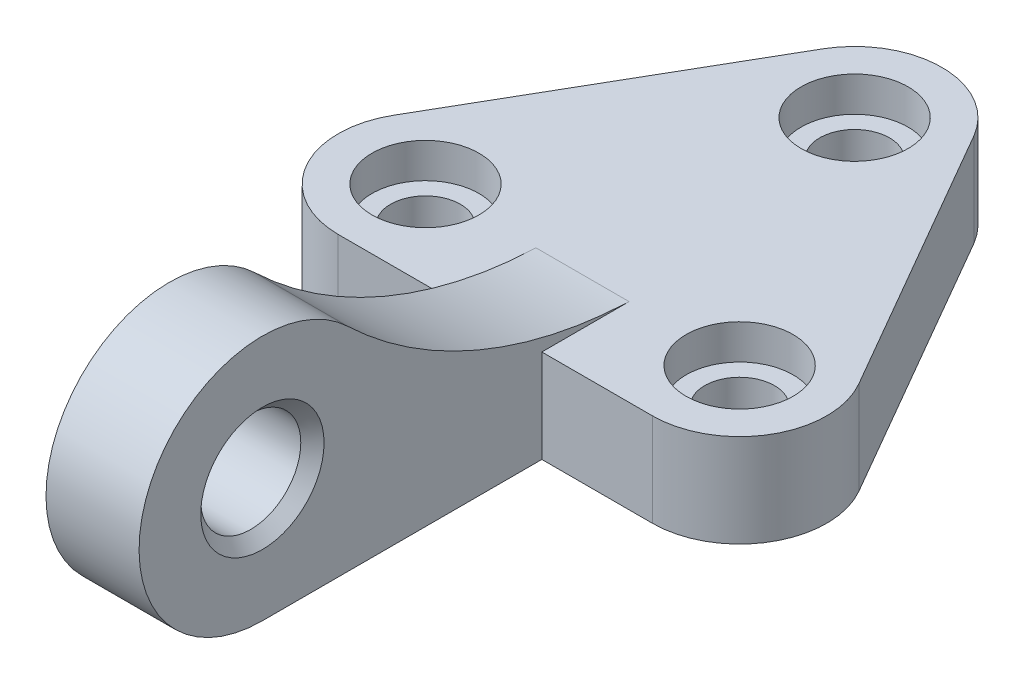
ISO-10303-21;
HEADER;
FILE_DESCRIPTION(('STEP AP214'),'2;1');
FILE_NAME('part.step','',(''),(''),'','','');
FILE_SCHEMA(('AUTOMOTIVE_DESIGN { 1 0 10303 214 1 1 1 1 }'));
ENDSEC;
DATA;
#1=APPLICATION_CONTEXT('core data for automotive mechanical design processes');
#2=APPLICATION_PROTOCOL_DEFINITION('international standard','automotive_design',2000,#1);
#3=PRODUCT_CONTEXT('',#1,'mechanical');
#4=PRODUCT('Part','Part','',(#3));
#5=PRODUCT_RELATED_PRODUCT_CATEGORY('part','',(#4));
#6=PRODUCT_DEFINITION_FORMATION('','',#4);
#7=PRODUCT_DEFINITION_CONTEXT('part definition',#1,'design');
#8=PRODUCT_DEFINITION('design','',#6,#7);
#9=PRODUCT_DEFINITION_SHAPE('','',#8);
#10=(LENGTH_UNIT() NAMED_UNIT(*) SI_UNIT(.MILLI.,.METRE.));
#11=(NAMED_UNIT(*) PLANE_ANGLE_UNIT() SI_UNIT($,.RADIAN.));
#12=(NAMED_UNIT(*) SI_UNIT($,.STERADIAN.) SOLID_ANGLE_UNIT());
#13=UNCERTAINTY_MEASURE_WITH_UNIT(LENGTH_MEASURE(1.E-05),#10,'distance_accuracy_value','');
#14=(GEOMETRIC_REPRESENTATION_CONTEXT(3) GLOBAL_UNCERTAINTY_ASSIGNED_CONTEXT((#13)) GLOBAL_UNIT_ASSIGNED_CONTEXT((#10,
#11,#12)) REPRESENTATION_CONTEXT('',''));
#15=CARTESIAN_POINT('',(0.,0.,0.));
#16=DIRECTION('',(0.,0.,1.));
#17=DIRECTION('',(1.,0.,0.));
#18=AXIS2_PLACEMENT_3D('',#15,#16,#17);
#19=CARTESIAN_POINT('',(64.9519052838322,40.,0.));
#20=DIRECTION('',(0.,0.,-1.));
#21=DIRECTION('',(-1.,0.,0.));
#22=AXIS2_PLACEMENT_3D('',#19,#20,#21);
#23=PLANE('',#22);
#24=DIRECTION('',(0.,-1.,0.));
#25=VECTOR('',#24,1.);
#26=CARTESIAN_POINT('',(112.451905283832,40.,0.));
#27=LINE('',#26,#25);
#28=CARTESIAN_POINT('',(112.451905283832,40.,1.94289029309402E-13));
#29=VERTEX_POINT('',#28);
#30=CARTESIAN_POINT('',(112.451905283832,0.,1.94289029309402E-13));
#31=VERTEX_POINT('',#30);
#32=EDGE_CURVE('E196',#29,#31,#27,.T.);
#33=ORIENTED_EDGE('',*,*,#32,.F.);
#34=DIRECTION('',(1.,0.,0.));
#35=VECTOR('',#34,1.);
#36=CARTESIAN_POINT('',(64.9519052838322,40.,0.));
#37=LINE('',#36,#35);
#38=CARTESIAN_POINT('',(64.9519052838322,40.,0.));
#39=VERTEX_POINT('',#38);
#40=EDGE_CURVE('E122',#39,#29,#37,.T.);
#41=ORIENTED_EDGE('',*,*,#40,.F.);
#42=DIRECTION('',(0.,-1.,0.));
#43=VECTOR('',#42,1.);
#44=CARTESIAN_POINT('',(64.9519052838322,40.,0.));
#45=LINE('',#44,#43);
#46=CARTESIAN_POINT('',(64.9519052838322,0.,0.));
#47=VERTEX_POINT('',#46);
#48=EDGE_CURVE('E133',#39,#47,#45,.T.);
#49=ORIENTED_EDGE('',*,*,#48,.T.);
#50=DIRECTION('',(1.,0.,0.));
#51=VECTOR('',#50,1.);
#52=CARTESIAN_POINT('',(64.9519052838322,0.,0.));
#53=LINE('',#52,#51);
#54=EDGE_CURVE('E159',#47,#31,#53,.T.);
#55=ORIENTED_EDGE('',*,*,#54,.T.);
#56=EDGE_LOOP('',(#33,#41,#49,#55));
#57=FACE_BOUND('',#56,.T.);
#58=ADVANCED_FACE('F39',(#57),#23,.F.);
#59=CARTESIAN_POINT('',(132.45190528383,40.,-154.413429510898));
#60=DIRECTION('',(0.,-1.,0.));
#61=DIRECTION('',(0.,0.,-1.));
#62=AXIS2_PLACEMENT_3D('',#59,#60,#61);
#63=CYLINDRICAL_SURFACE('',#62,37.5000000000003);
#64=CARTESIAN_POINT('',(132.45190528383,0.,-154.413429510898));
#65=DIRECTION('',(0.,1.,0.));
#66=DIRECTION('',(0.,0.,1.));
#67=AXIS2_PLACEMENT_3D('',#64,#65,#66);
#68=CIRCLE('',#67,37.5000000000003);
#69=CARTESIAN_POINT('',(164.927857925747,0.,-173.163429510899));
#70=VERTEX_POINT('',#69);
#71=CARTESIAN_POINT('',(99.9759526419135,0.,-173.163429510898));
#72=VERTEX_POINT('',#71);
#73=EDGE_CURVE('E146',#70,#72,#68,.T.);
#74=ORIENTED_EDGE('',*,*,#73,.T.);
#75=DIRECTION('',(0.,-1.,0.));
#76=VECTOR('',#75,1.);
#77=CARTESIAN_POINT('',(99.9759526419135,40.,-173.163429510898));
#78=LINE('',#77,#76);
#79=CARTESIAN_POINT('',(99.9759526419135,40.,-173.163429510898));
#80=VERTEX_POINT('',#79);
#81=EDGE_CURVE('E11',#80,#72,#78,.T.);
#82=ORIENTED_EDGE('',*,*,#81,.F.);
#83=CARTESIAN_POINT('',(132.45190528383,40.,-154.413429510898));
#84=DIRECTION('',(0.,1.,0.));
#85=DIRECTION('',(0.,0.,1.));
#86=AXIS2_PLACEMENT_3D('',#83,#84,#85);
#87=CIRCLE('',#86,37.5000000000003);
#88=CARTESIAN_POINT('',(164.927857925747,40.,-173.163429510899));
#89=VERTEX_POINT('',#88);
#90=EDGE_CURVE('E168',#89,#80,#87,.T.);
#91=ORIENTED_EDGE('',*,*,#90,.F.);
#92=DIRECTION('',(0.,-1.,0.));
#93=VECTOR('',#92,1.);
#94=CARTESIAN_POINT('',(164.927857925747,40.,-173.163429510899));
#95=LINE('',#94,#93);
#96=EDGE_CURVE('E141',#89,#70,#95,.T.);
#97=ORIENTED_EDGE('',*,*,#96,.T.);
#98=EDGE_LOOP('',(#74,#82,#91,#97));
#99=FACE_BOUND('',#98,.T.);
#100=ADVANCED_FACE('F41',(#99),#63,.T.);
#101=CARTESIAN_POINT('',(99.9759526419135,40.,-173.163429510898));
#102=DIRECTION('',(0.866025403784444,0.,0.499999999999992));
#103=DIRECTION('',(0.499999999999992,0.,-0.866025403784444));
#104=AXIS2_PLACEMENT_3D('',#101,#102,#103);
#105=PLANE('',#104);
#106=DIRECTION('',(-0.499999999999992,0.,0.866025403784444));
#107=VECTOR('',#106,1.);
#108=CARTESIAN_POINT('',(99.9759526419135,0.,-173.163429510898));
#109=LINE('',#108,#107);
#110=CARTESIAN_POINT('',(32.4759526419156,0.,-56.2499999999997));
#111=VERTEX_POINT('',#110);
#112=EDGE_CURVE('E150',#72,#111,#109,.T.);
#113=ORIENTED_EDGE('',*,*,#112,.T.);
#114=DIRECTION('',(0.,-1.,0.));
#115=VECTOR('',#114,1.);
#116=CARTESIAN_POINT('',(32.4759526419156,40.,-56.2499999999997));
#117=LINE('',#116,#115);
#118=CARTESIAN_POINT('',(32.4759526419156,40.,-56.2499999999997));
#119=VERTEX_POINT('',#118);
#120=EDGE_CURVE('E48',#119,#111,#117,.T.);
#121=ORIENTED_EDGE('',*,*,#120,.F.);
#122=DIRECTION('',(-0.499999999999992,0.,0.866025403784444));
#123=VECTOR('',#122,1.);
#124=CARTESIAN_POINT('',(99.9759526419135,40.,-173.163429510898));
#125=LINE('',#124,#123);
#126=EDGE_CURVE('E99',#80,#119,#125,.T.);
#127=ORIENTED_EDGE('',*,*,#126,.F.);
#128=ORIENTED_EDGE('',*,*,#81,.T.);
#129=EDGE_LOOP('',(#113,#121,#127,#128));
#130=FACE_BOUND('',#129,.T.);
#131=ADVANCED_FACE('F180',(#130),#105,.F.);
#132=CARTESIAN_POINT('',(64.9519052838321,40.,-37.5));
#133=DIRECTION('',(0.,-1.,0.));
#134=DIRECTION('',(0.,0.,-1.));
#135=AXIS2_PLACEMENT_3D('',#132,#133,#134);
#136=CYLINDRICAL_SURFACE('',#135,37.5);
#137=CARTESIAN_POINT('',(64.9519052838321,0.,-37.5));
#138=DIRECTION('',(0.,-1.,0.));
#139=DIRECTION('',(0.,0.,-1.));
#140=AXIS2_PLACEMENT_3D('',#137,#138,#139);
#141=CIRCLE('',#140,37.5);
#142=EDGE_CURVE('E155',#47,#111,#141,.T.);
#143=ORIENTED_EDGE('',*,*,#142,.F.);
#144=ORIENTED_EDGE('',*,*,#48,.F.);
#145=CARTESIAN_POINT('',(64.9519052838321,40.,-37.5));
#146=DIRECTION('',(0.,-1.,0.));
#147=DIRECTION('',(0.,0.,-1.));
#148=AXIS2_PLACEMENT_3D('',#145,#146,#147);
#149=CIRCLE('',#148,37.5);
#150=EDGE_CURVE('E123',#39,#119,#149,.T.);
#151=ORIENTED_EDGE('',*,*,#150,.T.);
#152=ORIENTED_EDGE('',*,*,#120,.T.);
#153=EDGE_LOOP('',(#143,#144,#151,#152));
#154=FACE_BOUND('',#153,.T.);
#155=ADVANCED_FACE('F178',(#154),#136,.T.);
#156=CARTESIAN_POINT('',(152.451905283832,40.,1.94289029309402E-13));
#157=VERTEX_POINT('',#156);
#158=CARTESIAN_POINT('',(199.951905283831,40.,0.));
#159=VERTEX_POINT('',#158);
#160=EDGE_CURVE('E109',#157,#159,#37,.T.);
#161=ORIENTED_EDGE('',*,*,#160,.F.);
#162=DIRECTION('',(0.,-1.,0.));
#163=VECTOR('',#162,1.);
#164=CARTESIAN_POINT('',(152.451905283832,40.,0.));
#165=LINE('',#164,#163);
#166=CARTESIAN_POINT('',(152.451905283832,0.,2.22044604925031E-13));
#167=VERTEX_POINT('',#166);
#168=EDGE_CURVE('E213',#157,#167,#165,.T.);
#169=ORIENTED_EDGE('',*,*,#168,.T.);
#170=CARTESIAN_POINT('',(199.951905283831,0.,0.));
#171=VERTEX_POINT('',#170);
#172=EDGE_CURVE('E129',#167,#171,#53,.T.);
#173=ORIENTED_EDGE('',*,*,#172,.T.);
#174=DIRECTION('',(0.,-1.,0.));
#175=VECTOR('',#174,1.);
#176=CARTESIAN_POINT('',(199.951905283831,40.,0.));
#177=LINE('',#176,#175);
#178=EDGE_CURVE('E126',#159,#171,#177,.T.);
#179=ORIENTED_EDGE('',*,*,#178,.F.);
#180=EDGE_LOOP('',(#161,#169,#173,#179));
#181=FACE_BOUND('',#180,.T.);
#182=ADVANCED_FACE('F127',(#181),#23,.F.);
#183=CARTESIAN_POINT('',(199.951905283831,40.,-37.4999999999996));
#184=DIRECTION('',(0.,-1.,0.));
#185=DIRECTION('',(0.,0.,-1.));
#186=AXIS2_PLACEMENT_3D('',#183,#184,#185);
#187=CYLINDRICAL_SURFACE('',#186,37.4999999999998);
#188=CARTESIAN_POINT('',(199.951905283831,0.,-37.4999999999996));
#189=DIRECTION('',(0.,1.,0.));
#190=DIRECTION('',(0.,0.,1.));
#191=AXIS2_PLACEMENT_3D('',#188,#189,#190);
#192=CIRCLE('',#191,37.4999999999998);
#193=CARTESIAN_POINT('',(232.427857925747,0.,-56.2499999999997));
#194=VERTEX_POINT('',#193);
#195=EDGE_CURVE('E163',#171,#194,#192,.T.);
#196=ORIENTED_EDGE('',*,*,#195,.T.);
#197=DIRECTION('',(0.,-1.,0.));
#198=VECTOR('',#197,1.);
#199=CARTESIAN_POINT('',(232.427857925747,40.,-56.2499999999997));
#200=LINE('',#199,#198);
#201=CARTESIAN_POINT('',(232.427857925747,40.,-56.2499999999997));
#202=VERTEX_POINT('',#201);
#203=EDGE_CURVE('E134',#202,#194,#200,.T.);
#204=ORIENTED_EDGE('',*,*,#203,.F.);
#205=CARTESIAN_POINT('',(199.951905283831,40.,-37.4999999999996));
#206=DIRECTION('',(0.,1.,0.));
#207=DIRECTION('',(0.,0.,1.));
#208=AXIS2_PLACEMENT_3D('',#205,#206,#207);
#209=CIRCLE('',#208,37.4999999999998);
#210=EDGE_CURVE('E114',#159,#202,#209,.T.);
#211=ORIENTED_EDGE('',*,*,#210,.F.);
#212=ORIENTED_EDGE('',*,*,#178,.T.);
#213=EDGE_LOOP('',(#196,#204,#211,#212));
#214=FACE_BOUND('',#213,.T.);
#215=ADVANCED_FACE('F136',(#214),#187,.T.);
#216=CARTESIAN_POINT('',(232.427857925748,40.,-56.2499999999998));
#217=DIRECTION('',(-0.866025403784436,0.,0.500000000000004));
#218=DIRECTION('',(0.500000000000004,0.,0.866025403784436));
#219=AXIS2_PLACEMENT_3D('',#216,#217,#218);
#220=PLANE('',#219);
#221=DIRECTION('',(-0.500000000000004,0.,-0.866025403784436));
#222=VECTOR('',#221,1.);
#223=CARTESIAN_POINT('',(232.427857925748,0.,-56.2499999999998));
#224=LINE('',#223,#222);
#225=EDGE_CURVE('E91',#194,#70,#224,.T.);
#226=ORIENTED_EDGE('',*,*,#225,.T.);
#227=ORIENTED_EDGE('',*,*,#96,.F.);
#228=DIRECTION('',(-0.500000000000004,0.,-0.866025403784436));
#229=VECTOR('',#228,1.);
#230=CARTESIAN_POINT('',(232.427857925748,40.,-56.2499999999998));
#231=LINE('',#230,#229);
#232=EDGE_CURVE('E64',#202,#89,#231,.T.);
#233=ORIENTED_EDGE('',*,*,#232,.F.);
#234=ORIENTED_EDGE('',*,*,#203,.T.);
#235=EDGE_LOOP('',(#226,#227,#233,#234));
#236=FACE_BOUND('',#235,.T.);
#237=ADVANCED_FACE('F252',(#236),#220,.F.);
#238=CARTESIAN_POINT('',(132.45190528383,40.,-154.413429510898));
#239=DIRECTION('',(0.,1.,0.));
#240=DIRECTION('',(0.,0.,1.));
#241=AXIS2_PLACEMENT_3D('',#238,#239,#240);
#242=PLANE('',#241);
#243=DIRECTION('',(0.,0.,-1.));
#244=VECTOR('',#243,1.);
#245=CARTESIAN_POINT('',(152.451905283832,40.,-154.413429510898));
#246=LINE('',#245,#244);
#247=CARTESIAN_POINT('',(152.451905283832,40.,-37.5));
#248=VERTEX_POINT('',#247);
#249=EDGE_CURVE('E118',#157,#248,#246,.T.);
#250=ORIENTED_EDGE('',*,*,#249,.F.);
#251=ORIENTED_EDGE('',*,*,#160,.T.);
#252=ORIENTED_EDGE('',*,*,#210,.T.);
#253=ORIENTED_EDGE('',*,*,#232,.T.);
#254=ORIENTED_EDGE('',*,*,#90,.T.);
#255=ORIENTED_EDGE('',*,*,#126,.T.);
#256=ORIENTED_EDGE('',*,*,#150,.F.);
#257=ORIENTED_EDGE('',*,*,#40,.T.);
#258=DIRECTION('',(0.,0.,-1.));
#259=VECTOR('',#258,1.);
#260=CARTESIAN_POINT('',(112.451905283832,40.,-154.413429510898));
#261=LINE('',#260,#259);
#262=CARTESIAN_POINT('',(112.451905283832,40.,-37.5));
#263=VERTEX_POINT('',#262);
#264=EDGE_CURVE('E469',#29,#263,#261,.T.);
#265=ORIENTED_EDGE('',*,*,#264,.T.);
#266=DIRECTION('',(-1.,0.,0.));
#267=VECTOR('',#266,1.);
#268=CARTESIAN_POINT('',(152.451905283832,40.,-37.5));
#269=LINE('',#268,#267);
#270=EDGE_CURVE('E464',#248,#263,#269,.T.);
#271=ORIENTED_EDGE('',*,*,#270,.F.);
#272=EDGE_LOOP('',(#250,#251,#252,#253,#254,#255,#256,#257,#265,#271));
#273=FACE_BOUND('',#272,.T.);
#274=CARTESIAN_POINT('',(64.9519052838321,40.,-37.5));
#275=DIRECTION('',(0.,1.,0.));
#276=DIRECTION('',(0.,0.,1.));
#277=AXIS2_PLACEMENT_3D('',#274,#275,#276);
#278=CIRCLE('',#277,23.);
#279=CARTESIAN_POINT('',(64.9519052838321,40.,-14.5));
#280=VERTEX_POINT('',#279);
#281=EDGE_CURVE('E230',#280,#280,#278,.T.);
#282=ORIENTED_EDGE('',*,*,#281,.F.);
#283=EDGE_LOOP('',(#282));
#284=FACE_BOUND('',#283,.T.);
#285=CARTESIAN_POINT('',(199.951905283831,40.,-37.4999999999996));
#286=DIRECTION('',(0.,1.,0.));
#287=DIRECTION('',(0.,0.,1.));
#288=AXIS2_PLACEMENT_3D('',#285,#286,#287);
#289=CIRCLE('',#288,23.);
#290=CARTESIAN_POINT('',(199.951905283831,40.,-14.4999999999997));
#291=VERTEX_POINT('',#290);
#292=EDGE_CURVE('E238',#291,#291,#289,.T.);
#293=ORIENTED_EDGE('',*,*,#292,.F.);
#294=EDGE_LOOP('',(#293));
#295=FACE_BOUND('',#294,.T.);
#296=CARTESIAN_POINT('',(132.45190528383,40.,-154.413429510898));
#297=DIRECTION('',(0.,1.,0.));
#298=DIRECTION('',(0.,0.,1.));
#299=AXIS2_PLACEMENT_3D('',#296,#297,#298);
#300=CIRCLE('',#299,23.);
#301=CARTESIAN_POINT('',(132.45190528383,40.,-131.413429510898));
#302=VERTEX_POINT('',#301);
#303=EDGE_CURVE('E217',#302,#302,#300,.T.);
#304=ORIENTED_EDGE('',*,*,#303,.F.);
#305=EDGE_LOOP('',(#304));
#306=FACE_BOUND('',#305,.T.);
#307=ADVANCED_FACE('F111',(#273,#284,#295,#306),#242,.T.);
#308=CARTESIAN_POINT('',(132.45190528383,0.,-154.413429510898));
#309=DIRECTION('',(0.,1.,0.));
#310=DIRECTION('',(0.,0.,1.));
#311=AXIS2_PLACEMENT_3D('',#308,#309,#310);
#312=PLANE('',#311);
#313=CARTESIAN_POINT('',(64.9519052838321,0.,-37.5));
#314=DIRECTION('',(0.,1.,0.));
#315=DIRECTION('',(0.,0.,1.));
#316=AXIS2_PLACEMENT_3D('',#313,#314,#315);
#317=CIRCLE('',#316,15.);
#318=CARTESIAN_POINT('',(64.9519052838321,0.,-22.5));
#319=VERTEX_POINT('',#318);
#320=EDGE_CURVE('E501',#319,#319,#317,.T.);
#321=ORIENTED_EDGE('',*,*,#320,.T.);
#322=EDGE_LOOP('',(#321));
#323=FACE_BOUND('',#322,.T.);
#324=CARTESIAN_POINT('',(199.951905283831,0.,-37.4999999999996));
#325=DIRECTION('',(0.,1.,0.));
#326=DIRECTION('',(0.,0.,1.));
#327=AXIS2_PLACEMENT_3D('',#324,#325,#326);
#328=CIRCLE('',#327,15.);
#329=CARTESIAN_POINT('',(199.951905283831,0.,-22.4999999999997));
#330=VERTEX_POINT('',#329);
#331=EDGE_CURVE('E497',#330,#330,#328,.T.);
#332=ORIENTED_EDGE('',*,*,#331,.T.);
#333=EDGE_LOOP('',(#332));
#334=FACE_BOUND('',#333,.T.);
#335=CARTESIAN_POINT('',(132.45190528383,0.,-154.413429510898));
#336=DIRECTION('',(0.,1.,0.));
#337=DIRECTION('',(0.,0.,1.));
#338=AXIS2_PLACEMENT_3D('',#335,#336,#337);
#339=CIRCLE('',#338,15.);
#340=CARTESIAN_POINT('',(132.45190528383,0.,-139.413429510898));
#341=VERTEX_POINT('',#340);
#342=EDGE_CURVE('E485',#341,#341,#339,.T.);
#343=ORIENTED_EDGE('',*,*,#342,.T.);
#344=EDGE_LOOP('',(#343));
#345=FACE_BOUND('',#344,.T.);
#346=ORIENTED_EDGE('',*,*,#172,.F.);
#347=DIRECTION('',(0.,0.,-1.));
#348=VECTOR('',#347,1.);
#349=CARTESIAN_POINT('',(152.451905283832,0.,120.086570489101));
#350=LINE('',#349,#348);
#351=CARTESIAN_POINT('',(152.451905283832,0.,120.086570489101));
#352=VERTEX_POINT('',#351);
#353=EDGE_CURVE('E212',#352,#167,#350,.T.);
#354=ORIENTED_EDGE('',*,*,#353,.F.);
#355=DIRECTION('',(-1.,0.,0.));
#356=VECTOR('',#355,1.);
#357=CARTESIAN_POINT('',(152.451905283832,0.,120.086570489101));
#358=LINE('',#357,#356);
#359=CARTESIAN_POINT('',(112.451905283832,0.,120.086570489101));
#360=VERTEX_POINT('',#359);
#361=EDGE_CURVE('E443',#352,#360,#358,.T.);
#362=ORIENTED_EDGE('',*,*,#361,.T.);
#363=DIRECTION('',(0.,0.,-1.));
#364=VECTOR('',#363,1.);
#365=CARTESIAN_POINT('',(112.451905283832,0.,0.));
#366=LINE('',#365,#364);
#367=EDGE_CURVE('E190',#360,#31,#366,.T.);
#368=ORIENTED_EDGE('',*,*,#367,.T.);
#369=ORIENTED_EDGE('',*,*,#54,.F.);
#370=ORIENTED_EDGE('',*,*,#142,.T.);
#371=ORIENTED_EDGE('',*,*,#112,.F.);
#372=ORIENTED_EDGE('',*,*,#73,.F.);
#373=ORIENTED_EDGE('',*,*,#225,.F.);
#374=ORIENTED_EDGE('',*,*,#195,.F.);
#375=EDGE_LOOP('',(#346,#354,#362,#368,#369,#370,#371,#372,#373,#374));
#376=FACE_BOUND('',#375,.T.);
#377=ADVANCED_FACE('F185',(#323,#334,#345,#376),#312,.F.);
#378=CARTESIAN_POINT('',(132.45190528383,25.,-154.413429510898));
#379=DIRECTION('',(0.,1.,0.));
#380=DIRECTION('',(0.,0.,1.));
#381=AXIS2_PLACEMENT_3D('',#378,#379,#380);
#382=CYLINDRICAL_SURFACE('',#381,23.);
#383=CARTESIAN_POINT('',(132.45190528383,25.,-154.413429510898));
#384=DIRECTION('',(0.,1.,0.));
#385=DIRECTION('',(0.,0.,1.));
#386=AXIS2_PLACEMENT_3D('',#383,#384,#385);
#387=CIRCLE('',#386,23.);
#388=CARTESIAN_POINT('',(132.45190528383,25.,-131.413429510898));
#389=VERTEX_POINT('',#388);
#390=EDGE_CURVE('E222',#389,#389,#387,.T.);
#391=ORIENTED_EDGE('',*,*,#390,.F.);
#392=EDGE_LOOP('',(#391));
#393=FACE_BOUND('',#392,.T.);
#394=ORIENTED_EDGE('',*,*,#303,.T.);
#395=EDGE_LOOP('',(#394));
#396=FACE_BOUND('',#395,.T.);
#397=ADVANCED_FACE('F317',(#393,#396),#382,.F.);
#398=CARTESIAN_POINT('',(132.45190528383,25.,-154.413429510898));
#399=DIRECTION('',(0.,1.,0.));
#400=DIRECTION('',(0.,0.,1.));
#401=AXIS2_PLACEMENT_3D('',#398,#399,#400);
#402=PLANE('',#401);
#403=CARTESIAN_POINT('',(132.45190528383,25.,-154.413429510898));
#404=DIRECTION('',(0.,1.,0.));
#405=DIRECTION('',(0.,0.,1.));
#406=AXIS2_PLACEMENT_3D('',#403,#404,#405);
#407=CIRCLE('',#406,15.);
#408=CARTESIAN_POINT('',(132.45190528383,25.,-139.413429510898));
#409=VERTEX_POINT('',#408);
#410=EDGE_CURVE('E489',#409,#409,#407,.T.);
#411=ORIENTED_EDGE('',*,*,#410,.F.);
#412=EDGE_LOOP('',(#411));
#413=FACE_BOUND('',#412,.T.);
#414=ORIENTED_EDGE('',*,*,#390,.T.);
#415=EDGE_LOOP('',(#414));
#416=FACE_BOUND('',#415,.T.);
#417=ADVANCED_FACE('F327',(#413,#416),#402,.T.);
#418=CARTESIAN_POINT('',(199.951905283831,25.,-37.4999999999996));
#419=DIRECTION('',(0.,1.,0.));
#420=DIRECTION('',(0.,0.,1.));
#421=AXIS2_PLACEMENT_3D('',#418,#419,#420);
#422=CYLINDRICAL_SURFACE('',#421,23.);
#423=CARTESIAN_POINT('',(199.951905283831,25.,-37.4999999999996));
#424=DIRECTION('',(0.,1.,0.));
#425=DIRECTION('',(0.,0.,1.));
#426=AXIS2_PLACEMENT_3D('',#423,#424,#425);
#427=CIRCLE('',#426,23.);
#428=CARTESIAN_POINT('',(199.951905283831,25.,-14.4999999999997));
#429=VERTEX_POINT('',#428);
#430=EDGE_CURVE('E234',#429,#429,#427,.T.);
#431=ORIENTED_EDGE('',*,*,#430,.F.);
#432=EDGE_LOOP('',(#431));
#433=FACE_BOUND('',#432,.T.);
#434=ORIENTED_EDGE('',*,*,#292,.T.);
#435=EDGE_LOOP('',(#434));
#436=FACE_BOUND('',#435,.T.);
#437=ADVANCED_FACE('F337',(#433,#436),#422,.F.);
#438=CARTESIAN_POINT('',(199.951905283831,25.,-37.4999999999996));
#439=DIRECTION('',(0.,1.,0.));
#440=DIRECTION('',(0.,0.,1.));
#441=AXIS2_PLACEMENT_3D('',#438,#439,#440);
#442=PLANE('',#441);
#443=CARTESIAN_POINT('',(199.951905283831,25.,-37.4999999999996));
#444=DIRECTION('',(0.,1.,0.));
#445=DIRECTION('',(0.,0.,1.));
#446=AXIS2_PLACEMENT_3D('',#443,#444,#445);
#447=CIRCLE('',#446,15.);
#448=CARTESIAN_POINT('',(199.951905283831,25.,-22.4999999999997));
#449=VERTEX_POINT('',#448);
#450=EDGE_CURVE('E493',#449,#449,#447,.T.);
#451=ORIENTED_EDGE('',*,*,#450,.F.);
#452=EDGE_LOOP('',(#451));
#453=FACE_BOUND('',#452,.T.);
#454=ORIENTED_EDGE('',*,*,#430,.T.);
#455=EDGE_LOOP('',(#454));
#456=FACE_BOUND('',#455,.T.);
#457=ADVANCED_FACE('F347',(#453,#456),#442,.T.);
#458=CARTESIAN_POINT('',(64.9519052838321,25.,-37.5));
#459=DIRECTION('',(0.,1.,0.));
#460=DIRECTION('',(0.,0.,1.));
#461=AXIS2_PLACEMENT_3D('',#458,#459,#460);
#462=CYLINDRICAL_SURFACE('',#461,23.);
#463=CARTESIAN_POINT('',(64.9519052838321,25.,-37.5));
#464=DIRECTION('',(0.,1.,0.));
#465=DIRECTION('',(0.,0.,1.));
#466=AXIS2_PLACEMENT_3D('',#463,#464,#465);
#467=CIRCLE('',#466,23.);
#468=CARTESIAN_POINT('',(64.9519052838321,25.,-14.5));
#469=VERTEX_POINT('',#468);
#470=EDGE_CURVE('E151',#469,#469,#467,.T.);
#471=ORIENTED_EDGE('',*,*,#470,.F.);
#472=EDGE_LOOP('',(#471));
#473=FACE_BOUND('',#472,.T.);
#474=ORIENTED_EDGE('',*,*,#281,.T.);
#475=EDGE_LOOP('',(#474));
#476=FACE_BOUND('',#475,.T.);
#477=ADVANCED_FACE('F356',(#473,#476),#462,.F.);
#478=CARTESIAN_POINT('',(64.9519052838321,25.,-37.5));
#479=DIRECTION('',(0.,1.,0.));
#480=DIRECTION('',(0.,0.,1.));
#481=AXIS2_PLACEMENT_3D('',#478,#479,#480);
#482=PLANE('',#481);
#483=CARTESIAN_POINT('',(64.9519052838321,25.,-37.5));
#484=DIRECTION('',(0.,1.,0.));
#485=DIRECTION('',(0.,0.,1.));
#486=AXIS2_PLACEMENT_3D('',#483,#484,#485);
#487=CIRCLE('',#486,15.);
#488=CARTESIAN_POINT('',(64.9519052838321,25.,-22.5));
#489=VERTEX_POINT('',#488);
#490=EDGE_CURVE('E505',#489,#489,#487,.T.);
#491=ORIENTED_EDGE('',*,*,#490,.F.);
#492=EDGE_LOOP('',(#491));
#493=FACE_BOUND('',#492,.T.);
#494=ORIENTED_EDGE('',*,*,#470,.T.);
#495=EDGE_LOOP('',(#494));
#496=FACE_BOUND('',#495,.T.);
#497=ADVANCED_FACE('F365',(#493,#496),#482,.T.);
#498=CARTESIAN_POINT('',(152.451905283832,53.,120.086570489101));
#499=DIRECTION('',(1.,0.,0.));
#500=DIRECTION('',(0.,0.,-1.));
#501=AXIS2_PLACEMENT_3D('',#498,#499,#500);
#502=PLANE('',#501);
#503=CARTESIAN_POINT('',(152.451905283832,53.,120.086570489101));
#504=DIRECTION('',(1.,0.,0.));
#505=DIRECTION('',(0.,0.,-1.));
#506=AXIS2_PLACEMENT_3D('',#503,#504,#505);
#507=CIRCLE('',#506,26.5);
#508=CARTESIAN_POINT('',(152.451905283832,53.,93.5865704891015));
#509=VERTEX_POINT('',#508);
#510=EDGE_CURVE('E481',#509,#509,#507,.T.);
#511=ORIENTED_EDGE('',*,*,#510,.F.);
#512=EDGE_LOOP('',(#511));
#513=FACE_BOUND('',#512,.T.);
#514=ORIENTED_EDGE('',*,*,#168,.F.);
#515=ORIENTED_EDGE('',*,*,#249,.T.);
#516=CARTESIAN_POINT('',(152.451905283832,224.865500344199,-44.5531399028419));
#517=DIRECTION('',(-1.,0.,0.));
#518=DIRECTION('',(0.,0.,1.));
#519=AXIS2_PLACEMENT_3D('',#516,#517,#518);
#520=CIRCLE('',#519,185.);
#521=CARTESIAN_POINT('',(152.451905283832,91.2366625942735,83.3856490612724));
#522=VERTEX_POINT('',#521);
#523=EDGE_CURVE('E456',#248,#522,#520,.T.);
#524=ORIENTED_EDGE('',*,*,#523,.T.);
#525=CARTESIAN_POINT('',(152.451905283832,53.,120.086570489101));
#526=DIRECTION('',(1.,0.,0.));
#527=DIRECTION('',(0.,0.,-1.));
#528=AXIS2_PLACEMENT_3D('',#525,#526,#527);
#529=CIRCLE('',#528,53.);
#530=EDGE_CURVE('E461',#522,#352,#529,.T.);
#531=ORIENTED_EDGE('',*,*,#530,.T.);
#532=ORIENTED_EDGE('',*,*,#353,.T.);
#533=EDGE_LOOP('',(#514,#515,#524,#531,#532));
#534=FACE_BOUND('',#533,.T.);
#535=ADVANCED_FACE('F214',(#513,#534),#502,.T.);
#536=CARTESIAN_POINT('',(112.451905283832,53.,120.086570489101));
#537=DIRECTION('',(1.,0.,0.));
#538=DIRECTION('',(0.,0.,-1.));
#539=AXIS2_PLACEMENT_3D('',#536,#537,#538);
#540=PLANE('',#539);
#541=CARTESIAN_POINT('',(112.451905283832,53.,120.086570489101));
#542=DIRECTION('',(1.,0.,0.));
#543=DIRECTION('',(0.,0.,-1.));
#544=AXIS2_PLACEMENT_3D('',#541,#542,#543);
#545=CIRCLE('',#544,21.5);
#546=CARTESIAN_POINT('',(112.451905283832,53.,98.5865704891015));
#547=VERTEX_POINT('',#546);
#548=EDGE_CURVE('E447',#547,#547,#545,.T.);
#549=ORIENTED_EDGE('',*,*,#548,.T.);
#550=EDGE_LOOP('',(#549));
#551=FACE_BOUND('',#550,.T.);
#552=ORIENTED_EDGE('',*,*,#264,.F.);
#553=ORIENTED_EDGE('',*,*,#32,.T.);
#554=ORIENTED_EDGE('',*,*,#367,.F.);
#555=CARTESIAN_POINT('',(112.451905283832,53.,120.086570489101));
#556=DIRECTION('',(1.,0.,0.));
#557=DIRECTION('',(0.,0.,-1.));
#558=AXIS2_PLACEMENT_3D('',#555,#556,#557);
#559=CIRCLE('',#558,53.);
#560=CARTESIAN_POINT('',(112.451905283832,91.2366625942735,83.3856490612724));
#561=VERTEX_POINT('',#560);
#562=EDGE_CURVE('E440',#561,#360,#559,.T.);
#563=ORIENTED_EDGE('',*,*,#562,.F.);
#564=CARTESIAN_POINT('',(112.451905283832,224.865500344199,-44.5531399028419));
#565=DIRECTION('',(-1.,0.,0.));
#566=DIRECTION('',(0.,0.,1.));
#567=AXIS2_PLACEMENT_3D('',#564,#565,#566);
#568=CIRCLE('',#567,185.);
#569=EDGE_CURVE('E55',#263,#561,#568,.T.);
#570=ORIENTED_EDGE('',*,*,#569,.F.);
#571=EDGE_LOOP('',(#552,#553,#554,#563,#570));
#572=FACE_BOUND('',#571,.T.);
#573=ADVANCED_FACE('F424',(#551,#572),#540,.F.);
#574=CARTESIAN_POINT('',(152.451905283832,53.,120.086570489101));
#575=DIRECTION('',(-1.,0.,0.));
#576=DIRECTION('',(0.,0.,1.));
#577=AXIS2_PLACEMENT_3D('',#574,#575,#576);
#578=CYLINDRICAL_SURFACE('',#577,53.);
#579=ORIENTED_EDGE('',*,*,#562,.T.);
#580=ORIENTED_EDGE('',*,*,#361,.F.);
#581=ORIENTED_EDGE('',*,*,#530,.F.);
#582=DIRECTION('',(-1.,0.,0.));
#583=VECTOR('',#582,1.);
#584=CARTESIAN_POINT('',(152.451905283832,91.2366625942735,83.3856490612724));
#585=LINE('',#584,#583);
#586=EDGE_CURVE('E445',#522,#561,#585,.T.);
#587=ORIENTED_EDGE('',*,*,#586,.T.);
#588=EDGE_LOOP('',(#579,#580,#581,#587));
#589=FACE_BOUND('',#588,.T.);
#590=ADVANCED_FACE('F428',(#589),#578,.T.);
#591=CARTESIAN_POINT('',(152.451905283832,224.865500344199,-44.5531399028419));
#592=DIRECTION('',(-1.,0.,0.));
#593=DIRECTION('',(0.,0.,1.));
#594=AXIS2_PLACEMENT_3D('',#591,#592,#593);
#595=CYLINDRICAL_SURFACE('',#594,185.);
#596=ORIENTED_EDGE('',*,*,#569,.T.);
#597=ORIENTED_EDGE('',*,*,#586,.F.);
#598=ORIENTED_EDGE('',*,*,#523,.F.);
#599=ORIENTED_EDGE('',*,*,#270,.T.);
#600=EDGE_LOOP('',(#596,#597,#598,#599));
#601=FACE_BOUND('',#600,.T.);
#602=ADVANCED_FACE('F421',(#601),#595,.F.);
#603=CARTESIAN_POINT('',(152.451905283832,53.,120.086570489101));
#604=DIRECTION('',(1.,0.,0.));
#605=DIRECTION('',(0.,0.,-1.));
#606=AXIS2_PLACEMENT_3D('',#603,#604,#605);
#607=CYLINDRICAL_SURFACE('',#606,21.5);
#608=ORIENTED_EDGE('',*,*,#548,.F.);
#609=EDGE_LOOP('',(#608));
#610=FACE_BOUND('',#609,.T.);
#611=CARTESIAN_POINT('',(147.451905283832,53.,120.086570489101));
#612=DIRECTION('',(1.,0.,0.));
#613=DIRECTION('',(0.,0.,-1.));
#614=AXIS2_PLACEMENT_3D('',#611,#612,#613);
#615=CIRCLE('',#614,21.5);
#616=CARTESIAN_POINT('',(147.451905283832,53.,98.5865704891015));
#617=VERTEX_POINT('',#616);
#618=EDGE_CURVE('E453',#617,#617,#615,.T.);
#619=ORIENTED_EDGE('',*,*,#618,.T.);
#620=EDGE_LOOP('',(#619));
#621=FACE_BOUND('',#620,.T.);
#622=ADVANCED_FACE('F417',(#610,#621),#607,.F.);
#623=CARTESIAN_POINT('',(152.451905283832,53.,120.086570489101));
#624=DIRECTION('',(1.,0.,0.));
#625=DIRECTION('',(0.,0.,-1.));
#626=AXIS2_PLACEMENT_3D('',#623,#624,#625);
#627=CONICAL_SURFACE('',#626,26.5,0.785398163397448);
#628=ORIENTED_EDGE('',*,*,#618,.F.);
#629=EDGE_LOOP('',(#628));
#630=FACE_BOUND('',#629,.T.);
#631=ORIENTED_EDGE('',*,*,#510,.T.);
#632=EDGE_LOOP('',(#631));
#633=FACE_BOUND('',#632,.T.);
#634=ADVANCED_FACE('F387',(#630,#633),#627,.F.);
#635=CARTESIAN_POINT('',(132.45190528383,25.,-154.413429510898));
#636=DIRECTION('',(0.,1.,0.));
#637=DIRECTION('',(0.,0.,1.));
#638=AXIS2_PLACEMENT_3D('',#635,#636,#637);
#639=CYLINDRICAL_SURFACE('',#638,15.);
#640=ORIENTED_EDGE('',*,*,#342,.F.);
#641=EDGE_LOOP('',(#640));
#642=FACE_BOUND('',#641,.T.);
#643=ORIENTED_EDGE('',*,*,#410,.T.);
#644=EDGE_LOOP('',(#643));
#645=FACE_BOUND('',#644,.T.);
#646=ADVANCED_FACE('F381',(#642,#645),#639,.F.);
#647=CARTESIAN_POINT('',(199.951905283831,40.,-37.4999999999996));
#648=DIRECTION('',(0.,1.,0.));
#649=DIRECTION('',(0.,0.,1.));
#650=AXIS2_PLACEMENT_3D('',#647,#648,#649);
#651=CYLINDRICAL_SURFACE('',#650,15.);
#652=ORIENTED_EDGE('',*,*,#450,.T.);
#653=EDGE_LOOP('',(#652));
#654=FACE_BOUND('',#653,.T.);
#655=ORIENTED_EDGE('',*,*,#331,.F.);
#656=EDGE_LOOP('',(#655));
#657=FACE_BOUND('',#656,.T.);
#658=ADVANCED_FACE('F386',(#654,#657),#651,.F.);
#659=CARTESIAN_POINT('',(64.9519052838321,25.,-37.5));
#660=DIRECTION('',(0.,1.,0.));
#661=DIRECTION('',(0.,0.,1.));
#662=AXIS2_PLACEMENT_3D('',#659,#660,#661);
#663=CYLINDRICAL_SURFACE('',#662,15.);
#664=ORIENTED_EDGE('',*,*,#320,.F.);
#665=EDGE_LOOP('',(#664));
#666=FACE_BOUND('',#665,.T.);
#667=ORIENTED_EDGE('',*,*,#490,.T.);
#668=EDGE_LOOP('',(#667));
#669=FACE_BOUND('',#668,.T.);
#670=ADVANCED_FACE('F399',(#666,#669),#663,.F.);
#671=CLOSED_SHELL('',(#58,#100,#131,#155,#182,#215,#237,#307,#377,#397,#417,#437,#457,#477,#497,
#535,#573,#590,#602,#622,#634,#646,#658,#670));
#672=MANIFOLD_SOLID_BREP('B2',#671);
#673=ADVANCED_BREP_SHAPE_REPRESENTATION('',(#18,#672),#14);
#674=SHAPE_DEFINITION_REPRESENTATION(#9,#673);
ENDSEC;
END-ISO-10303-21;
